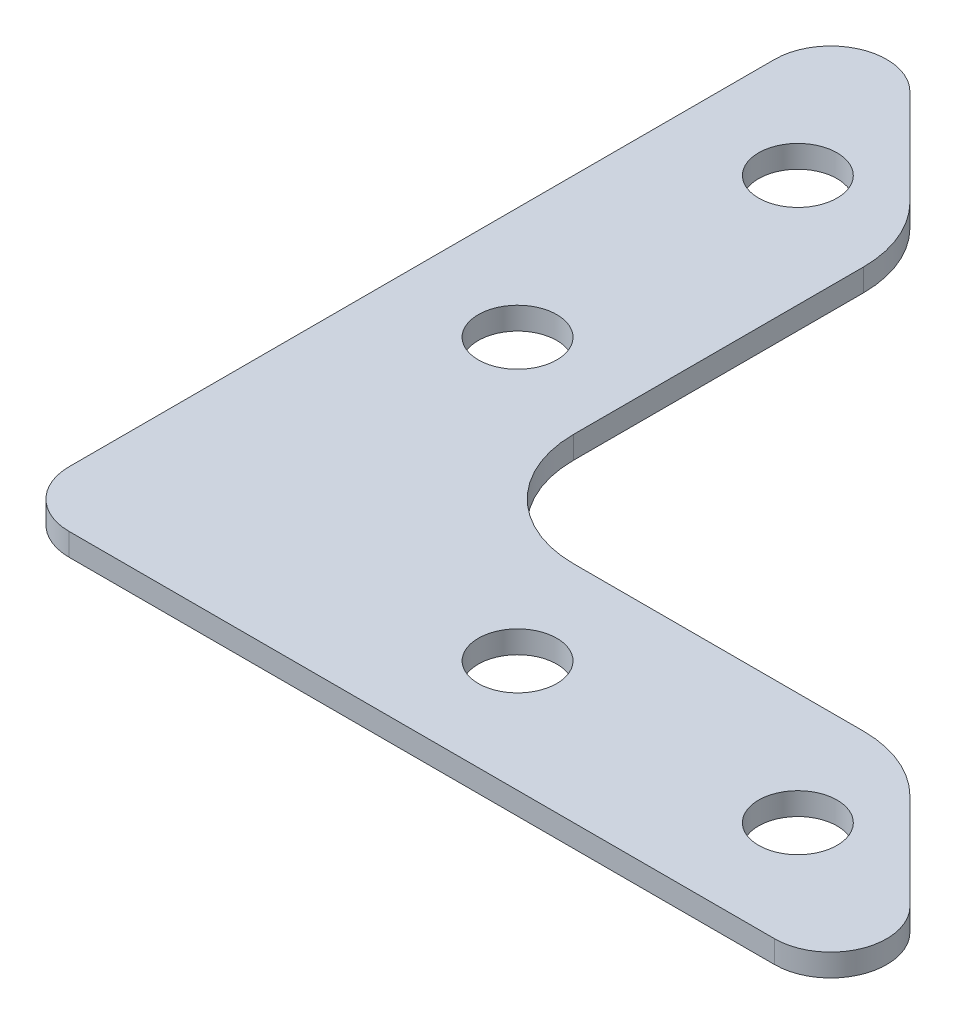
ISO-10303-21;
HEADER;
FILE_DESCRIPTION(('STEP AP214'),'2;1');
FILE_NAME('part.step','',(''),(''),'','','');
FILE_SCHEMA(('AUTOMOTIVE_DESIGN { 1 0 10303 214 1 1 1 1 }'));
ENDSEC;
DATA;
#1=APPLICATION_CONTEXT('core data for automotive mechanical design processes');
#2=APPLICATION_PROTOCOL_DEFINITION('international standard','automotive_design',2000,#1);
#3=PRODUCT_CONTEXT('',#1,'mechanical');
#4=PRODUCT('Part','Part','',(#3));
#5=PRODUCT_RELATED_PRODUCT_CATEGORY('part','',(#4));
#6=PRODUCT_DEFINITION_FORMATION('','',#4);
#7=PRODUCT_DEFINITION_CONTEXT('part definition',#1,'design');
#8=PRODUCT_DEFINITION('design','',#6,#7);
#9=PRODUCT_DEFINITION_SHAPE('','',#8);
#10=(LENGTH_UNIT() NAMED_UNIT(*) SI_UNIT(.MILLI.,.METRE.));
#11=(NAMED_UNIT(*) PLANE_ANGLE_UNIT() SI_UNIT($,.RADIAN.));
#12=(NAMED_UNIT(*) SI_UNIT($,.STERADIAN.) SOLID_ANGLE_UNIT());
#13=UNCERTAINTY_MEASURE_WITH_UNIT(LENGTH_MEASURE(1.E-05),#10,'distance_accuracy_value','');
#14=(GEOMETRIC_REPRESENTATION_CONTEXT(3) GLOBAL_UNCERTAINTY_ASSIGNED_CONTEXT((#13)) GLOBAL_UNIT_ASSIGNED_CONTEXT((#10,
#11,#12)) REPRESENTATION_CONTEXT('',''));
#15=CARTESIAN_POINT('',(0.,0.,0.));
#16=DIRECTION('',(0.,0.,1.));
#17=DIRECTION('',(1.,0.,0.));
#18=AXIS2_PLACEMENT_3D('',#15,#16,#17);
#19=CARTESIAN_POINT('',(5.,2.,-5.));
#20=DIRECTION('',(0.,1.,0.));
#21=DIRECTION('',(0.,0.,1.));
#22=AXIS2_PLACEMENT_3D('',#19,#20,#21);
#23=PLANE('',#22);
#24=CARTESIAN_POINT('',(35.,2.,-9.99999999999999));
#25=DIRECTION('',(0.,1.,0.));
#26=DIRECTION('',(0.,0.,1.));
#27=AXIS2_PLACEMENT_3D('',#24,#25,#26);
#28=CIRCLE('',#27,3.5);
#29=CARTESIAN_POINT('',(35.,2.,-6.49999999999999));
#30=VERTEX_POINT('',#29);
#31=EDGE_CURVE('E290',#30,#30,#28,.T.);
#32=ORIENTED_EDGE('',*,*,#31,.F.);
#33=EDGE_LOOP('',(#32));
#34=FACE_BOUND('',#33,.T.);
#35=CARTESIAN_POINT('',(10.,2.,-60.));
#36=DIRECTION('',(0.,1.,0.));
#37=DIRECTION('',(0.,0.,1.));
#38=AXIS2_PLACEMENT_3D('',#35,#36,#37);
#39=CIRCLE('',#38,3.50000000000001);
#40=CARTESIAN_POINT('',(10.,2.,-56.5));
#41=VERTEX_POINT('',#40);
#42=EDGE_CURVE('E156',#41,#41,#39,.T.);
#43=ORIENTED_EDGE('',*,*,#42,.F.);
#44=EDGE_LOOP('',(#43));
#45=FACE_BOUND('',#44,.T.);
#46=CARTESIAN_POINT('',(5.,2.,-5.));
#47=DIRECTION('',(0.,1.,0.));
#48=DIRECTION('',(0.,0.,1.));
#49=AXIS2_PLACEMENT_3D('',#46,#47,#48);
#50=CIRCLE('',#49,5.);
#51=CARTESIAN_POINT('',(0.,2.,-5.00000000000004));
#52=VERTEX_POINT('',#51);
#53=CARTESIAN_POINT('',(5.00000000000004,2.,0.));
#54=VERTEX_POINT('',#53);
#55=EDGE_CURVE('E175',#52,#54,#50,.T.);
#56=ORIENTED_EDGE('',*,*,#55,.T.);
#57=DIRECTION('',(1.,0.,0.));
#58=VECTOR('',#57,1.);
#59=CARTESIAN_POINT('',(67.9289321881346,2.,0.));
#60=LINE('',#59,#58);
#61=CARTESIAN_POINT('',(67.9289321881346,2.,0.));
#62=VERTEX_POINT('',#61);
#63=EDGE_CURVE('E103',#54,#62,#60,.T.);
#64=ORIENTED_EDGE('',*,*,#63,.T.);
#65=CARTESIAN_POINT('',(67.9289321881346,2.,-5.));
#66=DIRECTION('',(0.,1.,0.));
#67=DIRECTION('',(0.,0.,1.));
#68=AXIS2_PLACEMENT_3D('',#65,#66,#67);
#69=CIRCLE('',#68,5.);
#70=CARTESIAN_POINT('',(71.4644660940673,2.,-8.53553390593274));
#71=VERTEX_POINT('',#70);
#72=EDGE_CURVE('E202',#62,#71,#69,.T.);
#73=ORIENTED_EDGE('',*,*,#72,.T.);
#74=DIRECTION('',(-0.707106781186549,0.,-0.707106781186546));
#75=VECTOR('',#74,1.);
#76=CARTESIAN_POINT('',(71.4644660940673,2.,-8.53553390593274));
#77=LINE('',#76,#75);
#78=CARTESIAN_POINT('',(62.9289321881346,2.,-17.0710678118654));
#79=VERTEX_POINT('',#78);
#80=EDGE_CURVE('E221',#71,#79,#77,.T.);
#81=ORIENTED_EDGE('',*,*,#80,.T.);
#82=CARTESIAN_POINT('',(55.8578643762691,2.,-9.99999999999999));
#83=DIRECTION('',(0.,1.,0.));
#84=DIRECTION('',(0.,0.,-1.));
#85=AXIS2_PLACEMENT_3D('',#82,#83,#84);
#86=CIRCLE('',#85,10.);
#87=CARTESIAN_POINT('',(55.857864376269,2.,-20.));
#88=VERTEX_POINT('',#87);
#89=EDGE_CURVE('E218',#79,#88,#86,.T.);
#90=ORIENTED_EDGE('',*,*,#89,.T.);
#91=DIRECTION('',(-1.,0.,0.));
#92=VECTOR('',#91,1.);
#93=CARTESIAN_POINT('',(55.857864376269,2.,-20.));
#94=LINE('',#93,#92);
#95=CARTESIAN_POINT('',(30.,2.,-20.));
#96=VERTEX_POINT('',#95);
#97=EDGE_CURVE('E220',#88,#96,#94,.T.);
#98=ORIENTED_EDGE('',*,*,#97,.T.);
#99=CARTESIAN_POINT('',(30.,2.,-30.));
#100=DIRECTION('',(0.,-1.,0.));
#101=DIRECTION('',(0.,0.,1.));
#102=AXIS2_PLACEMENT_3D('',#99,#100,#101);
#103=CIRCLE('',#102,10.);
#104=CARTESIAN_POINT('',(20.,2.,-30.0000000000001));
#105=VERTEX_POINT('',#104);
#106=EDGE_CURVE('E223',#96,#105,#103,.T.);
#107=ORIENTED_EDGE('',*,*,#106,.T.);
#108=DIRECTION('',(0.,0.,-1.));
#109=VECTOR('',#108,1.);
#110=CARTESIAN_POINT('',(20.,2.,-30.0000000000001));
#111=LINE('',#110,#109);
#112=CARTESIAN_POINT('',(20.,2.,-55.857864376269));
#113=VERTEX_POINT('',#112);
#114=EDGE_CURVE('E229',#105,#113,#111,.T.);
#115=ORIENTED_EDGE('',*,*,#114,.T.);
#116=CARTESIAN_POINT('',(9.99999999999997,2.,-55.8578643762691));
#117=DIRECTION('',(0.,1.,0.));
#118=DIRECTION('',(0.,0.,-1.));
#119=AXIS2_PLACEMENT_3D('',#116,#117,#118);
#120=CIRCLE('',#119,10.);
#121=CARTESIAN_POINT('',(17.0710678118654,2.,-62.9289321881346));
#122=VERTEX_POINT('',#121);
#123=EDGE_CURVE('E134',#113,#122,#120,.T.);
#124=ORIENTED_EDGE('',*,*,#123,.T.);
#125=DIRECTION('',(-0.707106781186548,0.,-0.707106781186548));
#126=VECTOR('',#125,1.);
#127=CARTESIAN_POINT('',(8.53553390593274,2.,-71.4644660940673));
#128=LINE('',#127,#126);
#129=CARTESIAN_POINT('',(8.53553390593274,2.,-71.4644660940673));
#130=VERTEX_POINT('',#129);
#131=EDGE_CURVE('E128',#122,#130,#128,.T.);
#132=ORIENTED_EDGE('',*,*,#131,.T.);
#133=CARTESIAN_POINT('',(5.,2.,-67.9289321881345));
#134=DIRECTION('',(0.,1.,0.));
#135=DIRECTION('',(0.,0.,1.));
#136=AXIS2_PLACEMENT_3D('',#133,#134,#135);
#137=CIRCLE('',#136,5.);
#138=CARTESIAN_POINT('',(0.,2.,-67.9289321881345));
#139=VERTEX_POINT('',#138);
#140=EDGE_CURVE('E132',#130,#139,#137,.T.);
#141=ORIENTED_EDGE('',*,*,#140,.T.);
#142=DIRECTION('',(0.,0.,1.));
#143=VECTOR('',#142,1.);
#144=CARTESIAN_POINT('',(0.,2.,-5.00000000000004));
#145=LINE('',#144,#143);
#146=EDGE_CURVE('E48',#139,#52,#145,.T.);
#147=ORIENTED_EDGE('',*,*,#146,.T.);
#148=EDGE_LOOP('',(#56,#64,#73,#81,#90,#98,#107,#115,#124,#132,#141,#147));
#149=FACE_BOUND('',#148,.T.);
#150=CARTESIAN_POINT('',(10.,2.,-35.));
#151=DIRECTION('',(0.,1.,0.));
#152=DIRECTION('',(0.,0.,1.));
#153=AXIS2_PLACEMENT_3D('',#150,#151,#152);
#154=CIRCLE('',#153,3.5);
#155=CARTESIAN_POINT('',(10.,2.,-31.5));
#156=VERTEX_POINT('',#155);
#157=EDGE_CURVE('E296',#156,#156,#154,.T.);
#158=ORIENTED_EDGE('',*,*,#157,.F.);
#159=EDGE_LOOP('',(#158));
#160=FACE_BOUND('',#159,.T.);
#161=CARTESIAN_POINT('',(60.,2.,-10.));
#162=DIRECTION('',(0.,1.,0.));
#163=DIRECTION('',(0.,0.,1.));
#164=AXIS2_PLACEMENT_3D('',#161,#162,#163);
#165=CIRCLE('',#164,3.50000000000001);
#166=CARTESIAN_POINT('',(60.,2.,-6.49999999999998));
#167=VERTEX_POINT('',#166);
#168=EDGE_CURVE('E281',#167,#167,#165,.T.);
#169=ORIENTED_EDGE('',*,*,#168,.F.);
#170=EDGE_LOOP('',(#169));
#171=FACE_BOUND('',#170,.T.);
#172=ADVANCED_FACE('F31',(#34,#45,#149,#160,#171),#23,.T.);
#173=CARTESIAN_POINT('',(5.,0.,-5.));
#174=DIRECTION('',(0.,1.,0.));
#175=DIRECTION('',(0.,0.,1.));
#176=AXIS2_PLACEMENT_3D('',#173,#174,#175);
#177=PLANE('',#176);
#178=CARTESIAN_POINT('',(35.,0.,-9.99999999999999));
#179=DIRECTION('',(0.,1.,0.));
#180=DIRECTION('',(0.,0.,1.));
#181=AXIS2_PLACEMENT_3D('',#178,#179,#180);
#182=CIRCLE('',#181,3.5);
#183=CARTESIAN_POINT('',(35.,0.,-6.49999999999999));
#184=VERTEX_POINT('',#183);
#185=EDGE_CURVE('E287',#184,#184,#182,.T.);
#186=ORIENTED_EDGE('',*,*,#185,.T.);
#187=EDGE_LOOP('',(#186));
#188=FACE_BOUND('',#187,.T.);
#189=CARTESIAN_POINT('',(10.,0.,-60.));
#190=DIRECTION('',(0.,1.,0.));
#191=DIRECTION('',(0.,0.,1.));
#192=AXIS2_PLACEMENT_3D('',#189,#190,#191);
#193=CIRCLE('',#192,3.50000000000001);
#194=CARTESIAN_POINT('',(10.,0.,-56.5));
#195=VERTEX_POINT('',#194);
#196=EDGE_CURVE('E299',#195,#195,#193,.T.);
#197=ORIENTED_EDGE('',*,*,#196,.T.);
#198=EDGE_LOOP('',(#197));
#199=FACE_BOUND('',#198,.T.);
#200=CARTESIAN_POINT('',(5.,0.,-5.));
#201=DIRECTION('',(0.,1.,0.));
#202=DIRECTION('',(0.,0.,1.));
#203=AXIS2_PLACEMENT_3D('',#200,#201,#202);
#204=CIRCLE('',#203,5.);
#205=CARTESIAN_POINT('',(0.,0.,-5.00000000000004));
#206=VERTEX_POINT('',#205);
#207=CARTESIAN_POINT('',(5.00000000000004,0.,0.));
#208=VERTEX_POINT('',#207);
#209=EDGE_CURVE('E152',#206,#208,#204,.T.);
#210=ORIENTED_EDGE('',*,*,#209,.F.);
#211=DIRECTION('',(0.,0.,1.));
#212=VECTOR('',#211,1.);
#213=CARTESIAN_POINT('',(0.,0.,-5.00000000000004));
#214=LINE('',#213,#212);
#215=CARTESIAN_POINT('',(0.,0.,-67.9289321881345));
#216=VERTEX_POINT('',#215);
#217=EDGE_CURVE('E95',#216,#206,#214,.T.);
#218=ORIENTED_EDGE('',*,*,#217,.F.);
#219=CARTESIAN_POINT('',(5.,0.,-67.9289321881345));
#220=DIRECTION('',(0.,1.,0.));
#221=DIRECTION('',(0.,0.,1.));
#222=AXIS2_PLACEMENT_3D('',#219,#220,#221);
#223=CIRCLE('',#222,5.);
#224=CARTESIAN_POINT('',(8.53553390593274,0.,-71.4644660940673));
#225=VERTEX_POINT('',#224);
#226=EDGE_CURVE('E89',#225,#216,#223,.T.);
#227=ORIENTED_EDGE('',*,*,#226,.F.);
#228=DIRECTION('',(-0.707106781186548,0.,-0.707106781186548));
#229=VECTOR('',#228,1.);
#230=CARTESIAN_POINT('',(8.53553390593274,0.,-71.4644660940673));
#231=LINE('',#230,#229);
#232=CARTESIAN_POINT('',(17.0710678118654,0.,-62.9289321881346));
#233=VERTEX_POINT('',#232);
#234=EDGE_CURVE('E142',#233,#225,#231,.T.);
#235=ORIENTED_EDGE('',*,*,#234,.F.);
#236=CARTESIAN_POINT('',(9.99999999999997,0.,-55.8578643762691));
#237=DIRECTION('',(0.,1.,0.));
#238=DIRECTION('',(0.,0.,-1.));
#239=AXIS2_PLACEMENT_3D('',#236,#237,#238);
#240=CIRCLE('',#239,10.);
#241=CARTESIAN_POINT('',(20.,0.,-55.857864376269));
#242=VERTEX_POINT('',#241);
#243=EDGE_CURVE('E170',#242,#233,#240,.T.);
#244=ORIENTED_EDGE('',*,*,#243,.F.);
#245=DIRECTION('',(0.,0.,-1.));
#246=VECTOR('',#245,1.);
#247=CARTESIAN_POINT('',(20.,0.,-30.0000000000001));
#248=LINE('',#247,#246);
#249=CARTESIAN_POINT('',(20.,0.,-30.0000000000001));
#250=VERTEX_POINT('',#249);
#251=EDGE_CURVE('E168',#250,#242,#248,.T.);
#252=ORIENTED_EDGE('',*,*,#251,.F.);
#253=CARTESIAN_POINT('',(30.,0.,-30.));
#254=DIRECTION('',(0.,-1.,0.));
#255=DIRECTION('',(0.,0.,1.));
#256=AXIS2_PLACEMENT_3D('',#253,#254,#255);
#257=CIRCLE('',#256,10.);
#258=CARTESIAN_POINT('',(30.,0.,-20.));
#259=VERTEX_POINT('',#258);
#260=EDGE_CURVE('E166',#259,#250,#257,.T.);
#261=ORIENTED_EDGE('',*,*,#260,.F.);
#262=DIRECTION('',(-1.,0.,0.));
#263=VECTOR('',#262,1.);
#264=CARTESIAN_POINT('',(55.857864376269,0.,-20.));
#265=LINE('',#264,#263);
#266=CARTESIAN_POINT('',(55.857864376269,0.,-20.));
#267=VERTEX_POINT('',#266);
#268=EDGE_CURVE('E164',#267,#259,#265,.T.);
#269=ORIENTED_EDGE('',*,*,#268,.F.);
#270=CARTESIAN_POINT('',(55.8578643762691,0.,-9.99999999999999));
#271=DIRECTION('',(0.,1.,0.));
#272=DIRECTION('',(0.,0.,-1.));
#273=AXIS2_PLACEMENT_3D('',#270,#271,#272);
#274=CIRCLE('',#273,10.);
#275=CARTESIAN_POINT('',(62.9289321881346,0.,-17.0710678118654));
#276=VERTEX_POINT('',#275);
#277=EDGE_CURVE('E162',#276,#267,#274,.T.);
#278=ORIENTED_EDGE('',*,*,#277,.F.);
#279=DIRECTION('',(-0.707106781186549,0.,-0.707106781186546));
#280=VECTOR('',#279,1.);
#281=CARTESIAN_POINT('',(71.4644660940673,0.,-8.53553390593274));
#282=LINE('',#281,#280);
#283=CARTESIAN_POINT('',(71.4644660940673,0.,-8.53553390593274));
#284=VERTEX_POINT('',#283);
#285=EDGE_CURVE('E160',#284,#276,#282,.T.);
#286=ORIENTED_EDGE('',*,*,#285,.F.);
#287=CARTESIAN_POINT('',(67.9289321881346,0.,-5.));
#288=DIRECTION('',(0.,1.,0.));
#289=DIRECTION('',(0.,0.,1.));
#290=AXIS2_PLACEMENT_3D('',#287,#288,#289);
#291=CIRCLE('',#290,5.);
#292=CARTESIAN_POINT('',(67.9289321881346,0.,0.));
#293=VERTEX_POINT('',#292);
#294=EDGE_CURVE('E158',#293,#284,#291,.T.);
#295=ORIENTED_EDGE('',*,*,#294,.F.);
#296=DIRECTION('',(1.,0.,0.));
#297=VECTOR('',#296,1.);
#298=CARTESIAN_POINT('',(67.9289321881346,0.,0.));
#299=LINE('',#298,#297);
#300=EDGE_CURVE('E155',#208,#293,#299,.T.);
#301=ORIENTED_EDGE('',*,*,#300,.F.);
#302=EDGE_LOOP('',(#210,#218,#227,#235,#244,#252,#261,#269,#278,#286,#295,#301));
#303=FACE_BOUND('',#302,.T.);
#304=CARTESIAN_POINT('',(10.,0.,-35.));
#305=DIRECTION('',(0.,1.,0.));
#306=DIRECTION('',(0.,0.,1.));
#307=AXIS2_PLACEMENT_3D('',#304,#305,#306);
#308=CIRCLE('',#307,3.5);
#309=CARTESIAN_POINT('',(10.,0.,-31.5));
#310=VERTEX_POINT('',#309);
#311=EDGE_CURVE('E293',#310,#310,#308,.T.);
#312=ORIENTED_EDGE('',*,*,#311,.T.);
#313=EDGE_LOOP('',(#312));
#314=FACE_BOUND('',#313,.T.);
#315=CARTESIAN_POINT('',(60.,0.,-10.));
#316=DIRECTION('',(0.,1.,0.));
#317=DIRECTION('',(0.,0.,1.));
#318=AXIS2_PLACEMENT_3D('',#315,#316,#317);
#319=CIRCLE('',#318,3.50000000000001);
#320=CARTESIAN_POINT('',(60.,0.,-6.49999999999998));
#321=VERTEX_POINT('',#320);
#322=EDGE_CURVE('E284',#321,#321,#319,.T.);
#323=ORIENTED_EDGE('',*,*,#322,.T.);
#324=EDGE_LOOP('',(#323));
#325=FACE_BOUND('',#324,.T.);
#326=ADVANCED_FACE('F206',(#188,#199,#303,#314,#325),#177,.F.);
#327=CARTESIAN_POINT('',(5.,2.,-5.));
#328=DIRECTION('',(0.,-1.,0.));
#329=DIRECTION('',(0.,0.,-1.));
#330=AXIS2_PLACEMENT_3D('',#327,#328,#329);
#331=CYLINDRICAL_SURFACE('',#330,5.);
#332=ORIENTED_EDGE('',*,*,#209,.T.);
#333=DIRECTION('',(0.,-1.,0.));
#334=VECTOR('',#333,1.);
#335=CARTESIAN_POINT('',(5.00000000000004,2.,0.));
#336=LINE('',#335,#334);
#337=EDGE_CURVE('E11',#54,#208,#336,.T.);
#338=ORIENTED_EDGE('',*,*,#337,.F.);
#339=ORIENTED_EDGE('',*,*,#55,.F.);
#340=DIRECTION('',(0.,-1.,0.));
#341=VECTOR('',#340,1.);
#342=CARTESIAN_POINT('',(0.,2.,-5.00000000000004));
#343=LINE('',#342,#341);
#344=EDGE_CURVE('E148',#52,#206,#343,.T.);
#345=ORIENTED_EDGE('',*,*,#344,.T.);
#346=EDGE_LOOP('',(#332,#338,#339,#345));
#347=FACE_BOUND('',#346,.T.);
#348=ADVANCED_FACE('F33',(#347),#331,.T.);
#349=CARTESIAN_POINT('',(67.9289321881346,2.,0.));
#350=DIRECTION('',(0.,0.,-1.));
#351=DIRECTION('',(-1.,0.,0.));
#352=AXIS2_PLACEMENT_3D('',#349,#350,#351);
#353=PLANE('',#352);
#354=ORIENTED_EDGE('',*,*,#300,.T.);
#355=DIRECTION('',(0.,-1.,0.));
#356=VECTOR('',#355,1.);
#357=CARTESIAN_POINT('',(67.9289321881346,2.,0.));
#358=LINE('',#357,#356);
#359=EDGE_CURVE('E40',#62,#293,#358,.T.);
#360=ORIENTED_EDGE('',*,*,#359,.F.);
#361=ORIENTED_EDGE('',*,*,#63,.F.);
#362=ORIENTED_EDGE('',*,*,#337,.T.);
#363=EDGE_LOOP('',(#354,#360,#361,#362));
#364=FACE_BOUND('',#363,.T.);
#365=ADVANCED_FACE('F408',(#364),#353,.F.);
#366=CARTESIAN_POINT('',(67.9289321881346,2.,-5.));
#367=DIRECTION('',(0.,-1.,0.));
#368=DIRECTION('',(0.,0.,-1.));
#369=AXIS2_PLACEMENT_3D('',#366,#367,#368);
#370=CYLINDRICAL_SURFACE('',#369,5.);
#371=ORIENTED_EDGE('',*,*,#294,.T.);
#372=DIRECTION('',(0.,-1.,0.));
#373=VECTOR('',#372,1.);
#374=CARTESIAN_POINT('',(71.4644660940673,2.,-8.53553390593274));
#375=LINE('',#374,#373);
#376=EDGE_CURVE('E194',#71,#284,#375,.T.);
#377=ORIENTED_EDGE('',*,*,#376,.F.);
#378=ORIENTED_EDGE('',*,*,#72,.F.);
#379=ORIENTED_EDGE('',*,*,#359,.T.);
#380=EDGE_LOOP('',(#371,#377,#378,#379));
#381=FACE_BOUND('',#380,.T.);
#382=ADVANCED_FACE('F200',(#381),#370,.T.);
#383=CARTESIAN_POINT('',(71.4644660940673,2.,-8.53553390593274));
#384=DIRECTION('',(-0.707106781186546,0.,0.707106781186549));
#385=DIRECTION('',(0.707106781186549,0.,0.707106781186546));
#386=AXIS2_PLACEMENT_3D('',#383,#384,#385);
#387=PLANE('',#386);
#388=ORIENTED_EDGE('',*,*,#285,.T.);
#389=DIRECTION('',(0.,-1.,0.));
#390=VECTOR('',#389,1.);
#391=CARTESIAN_POINT('',(62.9289321881346,2.,-17.0710678118654));
#392=LINE('',#391,#390);
#393=EDGE_CURVE('E191',#79,#276,#392,.T.);
#394=ORIENTED_EDGE('',*,*,#393,.F.);
#395=ORIENTED_EDGE('',*,*,#80,.F.);
#396=ORIENTED_EDGE('',*,*,#376,.T.);
#397=EDGE_LOOP('',(#388,#394,#395,#396));
#398=FACE_BOUND('',#397,.T.);
#399=ADVANCED_FACE('F212',(#398),#387,.F.);
#400=CARTESIAN_POINT('',(55.8578643762691,2.,-9.99999999999999));
#401=DIRECTION('',(0.,-1.,0.));
#402=DIRECTION('',(0.,0.,-1.));
#403=AXIS2_PLACEMENT_3D('',#400,#401,#402);
#404=CYLINDRICAL_SURFACE('',#403,10.);
#405=ORIENTED_EDGE('',*,*,#277,.T.);
#406=DIRECTION('',(0.,-1.,0.));
#407=VECTOR('',#406,1.);
#408=CARTESIAN_POINT('',(55.857864376269,2.,-20.));
#409=LINE('',#408,#407);
#410=EDGE_CURVE('E188',#88,#267,#409,.T.);
#411=ORIENTED_EDGE('',*,*,#410,.F.);
#412=ORIENTED_EDGE('',*,*,#89,.F.);
#413=ORIENTED_EDGE('',*,*,#393,.T.);
#414=EDGE_LOOP('',(#405,#411,#412,#413));
#415=FACE_BOUND('',#414,.T.);
#416=ADVANCED_FACE('F216',(#415),#404,.T.);
#417=CARTESIAN_POINT('',(55.857864376269,2.,-20.));
#418=DIRECTION('',(0.,0.,1.));
#419=DIRECTION('',(1.,0.,0.));
#420=AXIS2_PLACEMENT_3D('',#417,#418,#419);
#421=PLANE('',#420);
#422=ORIENTED_EDGE('',*,*,#268,.T.);
#423=DIRECTION('',(0.,-1.,0.));
#424=VECTOR('',#423,1.);
#425=CARTESIAN_POINT('',(30.,2.,-20.));
#426=LINE('',#425,#424);
#427=EDGE_CURVE('E185',#96,#259,#426,.T.);
#428=ORIENTED_EDGE('',*,*,#427,.F.);
#429=ORIENTED_EDGE('',*,*,#97,.F.);
#430=ORIENTED_EDGE('',*,*,#410,.T.);
#431=EDGE_LOOP('',(#422,#428,#429,#430));
#432=FACE_BOUND('',#431,.T.);
#433=ADVANCED_FACE('F373',(#432),#421,.F.);
#434=CARTESIAN_POINT('',(30.,2.,-30.));
#435=DIRECTION('',(0.,-1.,0.));
#436=DIRECTION('',(0.,0.,-1.));
#437=AXIS2_PLACEMENT_3D('',#434,#435,#436);
#438=CYLINDRICAL_SURFACE('',#437,10.);
#439=ORIENTED_EDGE('',*,*,#260,.T.);
#440=DIRECTION('',(0.,-1.,0.));
#441=VECTOR('',#440,1.);
#442=CARTESIAN_POINT('',(20.,2.,-30.0000000000001));
#443=LINE('',#442,#441);
#444=EDGE_CURVE('E182',#105,#250,#443,.T.);
#445=ORIENTED_EDGE('',*,*,#444,.F.);
#446=ORIENTED_EDGE('',*,*,#106,.F.);
#447=ORIENTED_EDGE('',*,*,#427,.T.);
#448=EDGE_LOOP('',(#439,#445,#446,#447));
#449=FACE_BOUND('',#448,.T.);
#450=ADVANCED_FACE('F364',(#449),#438,.F.);
#451=CARTESIAN_POINT('',(20.,2.,-30.0000000000001));
#452=DIRECTION('',(-1.,0.,0.));
#453=DIRECTION('',(0.,0.,1.));
#454=AXIS2_PLACEMENT_3D('',#451,#452,#453);
#455=PLANE('',#454);
#456=ORIENTED_EDGE('',*,*,#251,.T.);
#457=DIRECTION('',(0.,-1.,0.));
#458=VECTOR('',#457,1.);
#459=CARTESIAN_POINT('',(20.,2.,-55.857864376269));
#460=LINE('',#459,#458);
#461=EDGE_CURVE('E179',#113,#242,#460,.T.);
#462=ORIENTED_EDGE('',*,*,#461,.F.);
#463=ORIENTED_EDGE('',*,*,#114,.F.);
#464=ORIENTED_EDGE('',*,*,#444,.T.);
#465=EDGE_LOOP('',(#456,#462,#463,#464));
#466=FACE_BOUND('',#465,.T.);
#467=ADVANCED_FACE('F235',(#466),#455,.F.);
#468=CARTESIAN_POINT('',(9.99999999999997,2.,-55.8578643762691));
#469=DIRECTION('',(0.,-1.,0.));
#470=DIRECTION('',(0.,0.,-1.));
#471=AXIS2_PLACEMENT_3D('',#468,#469,#470);
#472=CYLINDRICAL_SURFACE('',#471,10.);
#473=ORIENTED_EDGE('',*,*,#243,.T.);
#474=DIRECTION('',(0.,-1.,0.));
#475=VECTOR('',#474,1.);
#476=CARTESIAN_POINT('',(17.0710678118654,2.,-62.9289321881346));
#477=LINE('',#476,#475);
#478=EDGE_CURVE('E143',#122,#233,#477,.T.);
#479=ORIENTED_EDGE('',*,*,#478,.F.);
#480=ORIENTED_EDGE('',*,*,#123,.F.);
#481=ORIENTED_EDGE('',*,*,#461,.T.);
#482=EDGE_LOOP('',(#473,#479,#480,#481));
#483=FACE_BOUND('',#482,.T.);
#484=ADVANCED_FACE('F239',(#483),#472,.T.);
#485=CARTESIAN_POINT('',(8.53553390593274,2.,-71.4644660940673));
#486=DIRECTION('',(-0.707106781186547,0.,0.707106781186547));
#487=DIRECTION('',(0.707106781186548,0.,0.707106781186548));
#488=AXIS2_PLACEMENT_3D('',#485,#486,#487);
#489=PLANE('',#488);
#490=ORIENTED_EDGE('',*,*,#234,.T.);
#491=DIRECTION('',(0.,-1.,0.));
#492=VECTOR('',#491,1.);
#493=CARTESIAN_POINT('',(8.53553390593274,2.,-71.4644660940673));
#494=LINE('',#493,#492);
#495=EDGE_CURVE('E139',#130,#225,#494,.T.);
#496=ORIENTED_EDGE('',*,*,#495,.F.);
#497=ORIENTED_EDGE('',*,*,#131,.F.);
#498=ORIENTED_EDGE('',*,*,#478,.T.);
#499=EDGE_LOOP('',(#490,#496,#497,#498));
#500=FACE_BOUND('',#499,.T.);
#501=ADVANCED_FACE('F140',(#500),#489,.F.);
#502=CARTESIAN_POINT('',(5.,2.,-67.9289321881345));
#503=DIRECTION('',(0.,-1.,0.));
#504=DIRECTION('',(0.,0.,-1.));
#505=AXIS2_PLACEMENT_3D('',#502,#503,#504);
#506=CYLINDRICAL_SURFACE('',#505,5.);
#507=ORIENTED_EDGE('',*,*,#226,.T.);
#508=DIRECTION('',(0.,-1.,0.));
#509=VECTOR('',#508,1.);
#510=CARTESIAN_POINT('',(0.,2.,-67.9289321881345));
#511=LINE('',#510,#509);
#512=EDGE_CURVE('E144',#139,#216,#511,.T.);
#513=ORIENTED_EDGE('',*,*,#512,.F.);
#514=ORIENTED_EDGE('',*,*,#140,.F.);
#515=ORIENTED_EDGE('',*,*,#495,.T.);
#516=EDGE_LOOP('',(#507,#513,#514,#515));
#517=FACE_BOUND('',#516,.T.);
#518=ADVANCED_FACE('F146',(#517),#506,.T.);
#519=CARTESIAN_POINT('',(0.,2.,-5.00000000000004));
#520=DIRECTION('',(1.,0.,0.));
#521=DIRECTION('',(0.,0.,-1.));
#522=AXIS2_PLACEMENT_3D('',#519,#520,#521);
#523=PLANE('',#522);
#524=ORIENTED_EDGE('',*,*,#217,.T.);
#525=ORIENTED_EDGE('',*,*,#344,.F.);
#526=ORIENTED_EDGE('',*,*,#146,.F.);
#527=ORIENTED_EDGE('',*,*,#512,.T.);
#528=EDGE_LOOP('',(#524,#525,#526,#527));
#529=FACE_BOUND('',#528,.T.);
#530=ADVANCED_FACE('F243',(#529),#523,.F.);
#531=CARTESIAN_POINT('',(10.,2.,-60.));
#532=DIRECTION('',(0.,-1.,0.));
#533=DIRECTION('',(0.,0.,-1.));
#534=AXIS2_PLACEMENT_3D('',#531,#532,#533);
#535=CYLINDRICAL_SURFACE('',#534,3.50000000000001);
#536=ORIENTED_EDGE('',*,*,#42,.T.);
#537=EDGE_LOOP('',(#536));
#538=FACE_BOUND('',#537,.T.);
#539=ORIENTED_EDGE('',*,*,#196,.F.);
#540=EDGE_LOOP('',(#539));
#541=FACE_BOUND('',#540,.T.);
#542=ADVANCED_FACE('F245',(#538,#541),#535,.F.);
#543=CARTESIAN_POINT('',(10.,2.,-35.));
#544=DIRECTION('',(0.,-1.,0.));
#545=DIRECTION('',(0.,0.,-1.));
#546=AXIS2_PLACEMENT_3D('',#543,#544,#545);
#547=CYLINDRICAL_SURFACE('',#546,3.5);
#548=ORIENTED_EDGE('',*,*,#157,.T.);
#549=EDGE_LOOP('',(#548));
#550=FACE_BOUND('',#549,.T.);
#551=ORIENTED_EDGE('',*,*,#311,.F.);
#552=EDGE_LOOP('',(#551));
#553=FACE_BOUND('',#552,.T.);
#554=ADVANCED_FACE('F251',(#550,#553),#547,.F.);
#555=CARTESIAN_POINT('',(35.,2.,-9.99999999999999));
#556=DIRECTION('',(0.,-1.,0.));
#557=DIRECTION('',(0.,0.,-1.));
#558=AXIS2_PLACEMENT_3D('',#555,#556,#557);
#559=CYLINDRICAL_SURFACE('',#558,3.5);
#560=ORIENTED_EDGE('',*,*,#31,.T.);
#561=EDGE_LOOP('',(#560));
#562=FACE_BOUND('',#561,.T.);
#563=ORIENTED_EDGE('',*,*,#185,.F.);
#564=EDGE_LOOP('',(#563));
#565=FACE_BOUND('',#564,.T.);
#566=ADVANCED_FACE('F268',(#562,#565),#559,.F.);
#567=CARTESIAN_POINT('',(60.,2.,-10.));
#568=DIRECTION('',(0.,-1.,0.));
#569=DIRECTION('',(0.,0.,-1.));
#570=AXIS2_PLACEMENT_3D('',#567,#568,#569);
#571=CYLINDRICAL_SURFACE('',#570,3.50000000000001);
#572=ORIENTED_EDGE('',*,*,#168,.T.);
#573=EDGE_LOOP('',(#572));
#574=FACE_BOUND('',#573,.T.);
#575=ORIENTED_EDGE('',*,*,#322,.F.);
#576=EDGE_LOOP('',(#575));
#577=FACE_BOUND('',#576,.T.);
#578=ADVANCED_FACE('F272',(#574,#577),#571,.F.);
#579=CLOSED_SHELL('',(#172,#326,#348,#365,#382,#399,#416,#433,#450,#467,#484,#501,#518,#530,
#542,#554,#566,#578));
#580=MANIFOLD_SOLID_BREP('B2',#579);
#581=ADVANCED_BREP_SHAPE_REPRESENTATION('',(#18,#580),#14);
#582=SHAPE_DEFINITION_REPRESENTATION(#9,#581);
ENDSEC;
END-ISO-10303-21;
